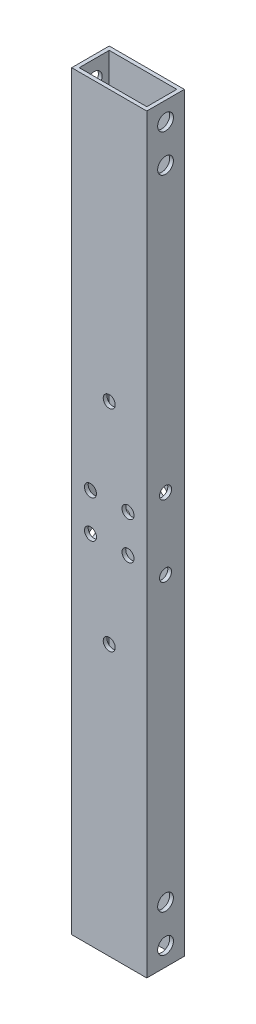
ISO-10303-21;
HEADER;
FILE_DESCRIPTION(('STEP AP214'),'2;1');
FILE_NAME('part.step','',(''),(''),'','','');
FILE_SCHEMA(('AUTOMOTIVE_DESIGN { 1 0 10303 214 1 1 1 1 }'));
ENDSEC;
DATA;
#1=APPLICATION_CONTEXT('core data for automotive mechanical design processes');
#2=APPLICATION_PROTOCOL_DEFINITION('international standard','automotive_design',2000,#1);
#3=PRODUCT_CONTEXT('',#1,'mechanical');
#4=PRODUCT('Part','Part','',(#3));
#5=PRODUCT_RELATED_PRODUCT_CATEGORY('part','',(#4));
#6=PRODUCT_DEFINITION_FORMATION('','',#4);
#7=PRODUCT_DEFINITION_CONTEXT('part definition',#1,'design');
#8=PRODUCT_DEFINITION('design','',#6,#7);
#9=PRODUCT_DEFINITION_SHAPE('','',#8);
#10=(LENGTH_UNIT() NAMED_UNIT(*) SI_UNIT(.MILLI.,.METRE.));
#11=(NAMED_UNIT(*) PLANE_ANGLE_UNIT() SI_UNIT($,.RADIAN.));
#12=(NAMED_UNIT(*) SI_UNIT($,.STERADIAN.) SOLID_ANGLE_UNIT());
#13=UNCERTAINTY_MEASURE_WITH_UNIT(LENGTH_MEASURE(1.E-05),#10,'distance_accuracy_value','');
#14=(GEOMETRIC_REPRESENTATION_CONTEXT(3) GLOBAL_UNCERTAINTY_ASSIGNED_CONTEXT((#13)) GLOBAL_UNIT_ASSIGNED_CONTEXT((#10,
#11,#12)) REPRESENTATION_CONTEXT('',''));
#15=CARTESIAN_POINT('',(0.,0.,0.));
#16=DIRECTION('',(0.,0.,1.));
#17=DIRECTION('',(1.,0.,0.));
#18=AXIS2_PLACEMENT_3D('',#15,#16,#17);
#19=CARTESIAN_POINT('',(0.,200.,0.));
#20=DIRECTION('',(0.,1.,0.));
#21=DIRECTION('',(0.,0.,1.));
#22=AXIS2_PLACEMENT_3D('',#19,#20,#21);
#23=PLANE('',#22);
#24=DIRECTION('',(0.,0.,-1.));
#25=VECTOR('',#24,1.);
#26=CARTESIAN_POINT('',(10.,200.,5.));
#27=LINE('',#26,#25);
#28=CARTESIAN_POINT('',(10.,200.,5.));
#29=VERTEX_POINT('',#28);
#30=CARTESIAN_POINT('',(10.,200.,-5.));
#31=VERTEX_POINT('',#30);
#32=EDGE_CURVE('E185',#29,#31,#27,.T.);
#33=ORIENTED_EDGE('',*,*,#32,.T.);
#34=DIRECTION('',(-1.,0.,0.));
#35=VECTOR('',#34,1.);
#36=CARTESIAN_POINT('',(-10.,200.,-5.));
#37=LINE('',#36,#35);
#38=CARTESIAN_POINT('',(-10.,200.,-5.));
#39=VERTEX_POINT('',#38);
#40=EDGE_CURVE('E189',#31,#39,#37,.T.);
#41=ORIENTED_EDGE('',*,*,#40,.T.);
#42=DIRECTION('',(0.,0.,1.));
#43=VECTOR('',#42,1.);
#44=CARTESIAN_POINT('',(-10.,200.,5.));
#45=LINE('',#44,#43);
#46=CARTESIAN_POINT('',(-10.,200.,5.));
#47=VERTEX_POINT('',#46);
#48=EDGE_CURVE('E193',#39,#47,#45,.T.);
#49=ORIENTED_EDGE('',*,*,#48,.T.);
#50=DIRECTION('',(1.,0.,0.));
#51=VECTOR('',#50,1.);
#52=CARTESIAN_POINT('',(-10.,200.,5.));
#53=LINE('',#52,#51);
#54=EDGE_CURVE('E196',#47,#29,#53,.T.);
#55=ORIENTED_EDGE('',*,*,#54,.T.);
#56=EDGE_LOOP('',(#33,#41,#49,#55));
#57=FACE_BOUND('',#56,.T.);
#58=DIRECTION('',(-1.,0.,0.));
#59=VECTOR('',#58,1.);
#60=CARTESIAN_POINT('',(0.,200.,-4.));
#61=LINE('',#60,#59);
#62=CARTESIAN_POINT('',(9.00000000000001,200.,-4.));
#63=VERTEX_POINT('',#62);
#64=CARTESIAN_POINT('',(-9.,200.,-4.));
#65=VERTEX_POINT('',#64);
#66=EDGE_CURVE('E144',#63,#65,#61,.T.);
#67=ORIENTED_EDGE('',*,*,#66,.F.);
#68=DIRECTION('',(0.,0.,-1.));
#69=VECTOR('',#68,1.);
#70=CARTESIAN_POINT('',(9.00000000000001,200.,0.));
#71=LINE('',#70,#69);
#72=CARTESIAN_POINT('',(9.00000000000001,200.,4.));
#73=VERTEX_POINT('',#72);
#74=EDGE_CURVE('E135',#73,#63,#71,.T.);
#75=ORIENTED_EDGE('',*,*,#74,.F.);
#76=DIRECTION('',(1.,0.,0.));
#77=VECTOR('',#76,1.);
#78=CARTESIAN_POINT('',(0.,200.,4.));
#79=LINE('',#78,#77);
#80=CARTESIAN_POINT('',(-9.,200.,4.));
#81=VERTEX_POINT('',#80);
#82=EDGE_CURVE('E161',#81,#73,#79,.T.);
#83=ORIENTED_EDGE('',*,*,#82,.F.);
#84=DIRECTION('',(0.,0.,1.));
#85=VECTOR('',#84,1.);
#86=CARTESIAN_POINT('',(-9.,200.,0.));
#87=LINE('',#86,#85);
#88=EDGE_CURVE('E157',#65,#81,#87,.T.);
#89=ORIENTED_EDGE('',*,*,#88,.F.);
#90=EDGE_LOOP('',(#67,#75,#83,#89));
#91=FACE_BOUND('',#90,.T.);
#92=ADVANCED_FACE('F67',(#57,#91),#23,.T.);
#93=CARTESIAN_POINT('',(0.,0.,0.));
#94=DIRECTION('',(0.,1.,0.));
#95=DIRECTION('',(0.,0.,1.));
#96=AXIS2_PLACEMENT_3D('',#93,#94,#95);
#97=PLANE('',#96);
#98=DIRECTION('',(0.,0.,-1.));
#99=VECTOR('',#98,1.);
#100=CARTESIAN_POINT('',(10.,0.,5.));
#101=LINE('',#100,#99);
#102=CARTESIAN_POINT('',(10.,0.,5.));
#103=VERTEX_POINT('',#102);
#104=CARTESIAN_POINT('',(10.,0.,-5.));
#105=VERTEX_POINT('',#104);
#106=EDGE_CURVE('E153',#103,#105,#101,.T.);
#107=ORIENTED_EDGE('',*,*,#106,.F.);
#108=DIRECTION('',(1.,0.,0.));
#109=VECTOR('',#108,1.);
#110=CARTESIAN_POINT('',(-10.,0.,5.));
#111=LINE('',#110,#109);
#112=CARTESIAN_POINT('',(-10.,0.,5.));
#113=VERTEX_POINT('',#112);
#114=EDGE_CURVE('E190',#113,#103,#111,.T.);
#115=ORIENTED_EDGE('',*,*,#114,.F.);
#116=DIRECTION('',(0.,0.,1.));
#117=VECTOR('',#116,1.);
#118=CARTESIAN_POINT('',(-10.,0.,5.));
#119=LINE('',#118,#117);
#120=CARTESIAN_POINT('',(-10.,0.,-5.));
#121=VERTEX_POINT('',#120);
#122=EDGE_CURVE('E206',#121,#113,#119,.T.);
#123=ORIENTED_EDGE('',*,*,#122,.F.);
#124=DIRECTION('',(-1.,0.,0.));
#125=VECTOR('',#124,1.);
#126=CARTESIAN_POINT('',(-10.,0.,-5.));
#127=LINE('',#126,#125);
#128=EDGE_CURVE('E203',#105,#121,#127,.T.);
#129=ORIENTED_EDGE('',*,*,#128,.F.);
#130=EDGE_LOOP('',(#107,#115,#123,#129));
#131=FACE_BOUND('',#130,.T.);
#132=DIRECTION('',(0.,0.,-1.));
#133=VECTOR('',#132,1.);
#134=CARTESIAN_POINT('',(9.00000000000001,0.,0.));
#135=LINE('',#134,#133);
#136=CARTESIAN_POINT('',(9.00000000000001,0.,4.));
#137=VERTEX_POINT('',#136);
#138=CARTESIAN_POINT('',(9.00000000000001,0.,-4.));
#139=VERTEX_POINT('',#138);
#140=EDGE_CURVE('E93',#137,#139,#135,.T.);
#141=ORIENTED_EDGE('',*,*,#140,.T.);
#142=DIRECTION('',(-1.,0.,0.));
#143=VECTOR('',#142,1.);
#144=CARTESIAN_POINT('',(0.,0.,-4.));
#145=LINE('',#144,#143);
#146=CARTESIAN_POINT('',(-9.,0.,-4.));
#147=VERTEX_POINT('',#146);
#148=EDGE_CURVE('E151',#139,#147,#145,.T.);
#149=ORIENTED_EDGE('',*,*,#148,.T.);
#150=DIRECTION('',(0.,0.,1.));
#151=VECTOR('',#150,1.);
#152=CARTESIAN_POINT('',(-9.,0.,0.));
#153=LINE('',#152,#151);
#154=CARTESIAN_POINT('',(-9.,0.,4.));
#155=VERTEX_POINT('',#154);
#156=EDGE_CURVE('E172',#147,#155,#153,.T.);
#157=ORIENTED_EDGE('',*,*,#156,.T.);
#158=DIRECTION('',(1.,0.,0.));
#159=VECTOR('',#158,1.);
#160=CARTESIAN_POINT('',(0.,0.,4.));
#161=LINE('',#160,#159);
#162=EDGE_CURVE('E145',#155,#137,#161,.T.);
#163=ORIENTED_EDGE('',*,*,#162,.T.);
#164=EDGE_LOOP('',(#141,#149,#157,#163));
#165=FACE_BOUND('',#164,.T.);
#166=ADVANCED_FACE('F411',(#131,#165),#97,.F.);
#167=CARTESIAN_POINT('',(10.,200.,5.));
#168=DIRECTION('',(-1.,0.,0.));
#169=DIRECTION('',(0.,0.,1.));
#170=AXIS2_PLACEMENT_3D('',#167,#168,#169);
#171=PLANE('',#170);
#172=CARTESIAN_POINT('',(10.,5.,0.));
#173=DIRECTION('',(1.,0.,0.));
#174=DIRECTION('',(0.,0.,-1.));
#175=AXIS2_PLACEMENT_3D('',#172,#173,#174);
#176=CIRCLE('',#175,2.1);
#177=CARTESIAN_POINT('',(10.,5.,-2.1));
#178=VERTEX_POINT('',#177);
#179=EDGE_CURVE('E486',#178,#178,#176,.T.);
#180=ORIENTED_EDGE('',*,*,#179,.F.);
#181=EDGE_LOOP('',(#180));
#182=FACE_BOUND('',#181,.T.);
#183=CARTESIAN_POINT('',(10.,15.,0.));
#184=DIRECTION('',(1.,0.,0.));
#185=DIRECTION('',(0.,0.,1.));
#186=AXIS2_PLACEMENT_3D('',#183,#184,#185);
#187=CIRCLE('',#186,2.1);
#188=CARTESIAN_POINT('',(10.,15.,2.1));
#189=VERTEX_POINT('',#188);
#190=EDGE_CURVE('E490',#189,#189,#187,.T.);
#191=ORIENTED_EDGE('',*,*,#190,.F.);
#192=EDGE_LOOP('',(#191));
#193=FACE_BOUND('',#192,.T.);
#194=CARTESIAN_POINT('',(10.,185.,0.));
#195=DIRECTION('',(1.,0.,0.));
#196=DIRECTION('',(0.,0.,-1.));
#197=AXIS2_PLACEMENT_3D('',#194,#195,#196);
#198=CIRCLE('',#197,2.1);
#199=CARTESIAN_POINT('',(10.,185.,-2.09999999999998));
#200=VERTEX_POINT('',#199);
#201=EDGE_CURVE('E494',#200,#200,#198,.T.);
#202=ORIENTED_EDGE('',*,*,#201,.F.);
#203=EDGE_LOOP('',(#202));
#204=FACE_BOUND('',#203,.T.);
#205=CARTESIAN_POINT('',(10.,195.,0.));
#206=DIRECTION('',(1.,0.,0.));
#207=DIRECTION('',(0.,0.,1.));
#208=AXIS2_PLACEMENT_3D('',#205,#206,#207);
#209=CIRCLE('',#208,2.1);
#210=CARTESIAN_POINT('',(10.,195.,2.10000000000002));
#211=VERTEX_POINT('',#210);
#212=EDGE_CURVE('E498',#211,#211,#209,.T.);
#213=ORIENTED_EDGE('',*,*,#212,.F.);
#214=EDGE_LOOP('',(#213));
#215=FACE_BOUND('',#214,.T.);
#216=CARTESIAN_POINT('',(10.,109.5,0.));
#217=DIRECTION('',(1.,0.,0.));
#218=DIRECTION('',(0.,0.,-1.));
#219=AXIS2_PLACEMENT_3D('',#216,#217,#218);
#220=CIRCLE('',#219,1.59999999999999);
#221=CARTESIAN_POINT('',(10.,109.5,-1.59999999999998));
#222=VERTEX_POINT('',#221);
#223=EDGE_CURVE('E341',#222,#222,#220,.T.);
#224=ORIENTED_EDGE('',*,*,#223,.F.);
#225=EDGE_LOOP('',(#224));
#226=FACE_BOUND('',#225,.T.);
#227=CARTESIAN_POINT('',(10.,90.5,0.));
#228=DIRECTION('',(1.,0.,0.));
#229=DIRECTION('',(0.,0.,1.));
#230=AXIS2_PLACEMENT_3D('',#227,#228,#229);
#231=CIRCLE('',#230,1.59999999999999);
#232=CARTESIAN_POINT('',(10.,90.5,1.59999999999999));
#233=VERTEX_POINT('',#232);
#234=EDGE_CURVE('E345',#233,#233,#231,.T.);
#235=ORIENTED_EDGE('',*,*,#234,.F.);
#236=EDGE_LOOP('',(#235));
#237=FACE_BOUND('',#236,.T.);
#238=ORIENTED_EDGE('',*,*,#106,.T.);
#239=DIRECTION('',(0.,-1.,0.));
#240=VECTOR('',#239,1.);
#241=CARTESIAN_POINT('',(10.,200.,-5.));
#242=LINE('',#241,#240);
#243=EDGE_CURVE('E12',#31,#105,#242,.T.);
#244=ORIENTED_EDGE('',*,*,#243,.F.);
#245=ORIENTED_EDGE('',*,*,#32,.F.);
#246=DIRECTION('',(0.,-1.,0.));
#247=VECTOR('',#246,1.);
#248=CARTESIAN_POINT('',(10.,200.,5.));
#249=LINE('',#248,#247);
#250=EDGE_CURVE('E199',#29,#103,#249,.T.);
#251=ORIENTED_EDGE('',*,*,#250,.T.);
#252=EDGE_LOOP('',(#238,#244,#245,#251));
#253=FACE_BOUND('',#252,.T.);
#254=ADVANCED_FACE('F69',(#182,#193,#204,#215,#226,#237,#253),#171,.F.);
#255=CARTESIAN_POINT('',(-10.,200.,-5.));
#256=DIRECTION('',(0.,0.,1.));
#257=DIRECTION('',(1.,0.,0.));
#258=AXIS2_PLACEMENT_3D('',#255,#256,#257);
#259=PLANE('',#258);
#260=CARTESIAN_POINT('',(-5.,105.,-5.));
#261=DIRECTION('',(0.,0.,-1.));
#262=DIRECTION('',(1.,0.,0.));
#263=AXIS2_PLACEMENT_3D('',#260,#261,#262);
#264=CIRCLE('',#263,1.59999999999999);
#265=CARTESIAN_POINT('',(-3.40000000000001,105.,-5.));
#266=VERTEX_POINT('',#265);
#267=EDGE_CURVE('E312',#266,#266,#264,.T.);
#268=ORIENTED_EDGE('',*,*,#267,.F.);
#269=EDGE_LOOP('',(#268));
#270=FACE_BOUND('',#269,.T.);
#271=CARTESIAN_POINT('',(-5.,95.,-5.));
#272=DIRECTION('',(0.,0.,-1.));
#273=DIRECTION('',(-1.,0.,0.));
#274=AXIS2_PLACEMENT_3D('',#271,#272,#273);
#275=CIRCLE('',#274,1.59999999999999);
#276=CARTESIAN_POINT('',(-6.59999999999999,95.,-5.));
#277=VERTEX_POINT('',#276);
#278=EDGE_CURVE('E304',#277,#277,#275,.T.);
#279=ORIENTED_EDGE('',*,*,#278,.F.);
#280=EDGE_LOOP('',(#279));
#281=FACE_BOUND('',#280,.T.);
#282=CARTESIAN_POINT('',(5.,95.,-5.));
#283=DIRECTION('',(0.,0.,-1.));
#284=DIRECTION('',(1.,0.,0.));
#285=AXIS2_PLACEMENT_3D('',#282,#283,#284);
#286=CIRCLE('',#285,1.59999999999999);
#287=CARTESIAN_POINT('',(6.59999999999999,95.,-5.));
#288=VERTEX_POINT('',#287);
#289=EDGE_CURVE('E295',#288,#288,#286,.T.);
#290=ORIENTED_EDGE('',*,*,#289,.F.);
#291=EDGE_LOOP('',(#290));
#292=FACE_BOUND('',#291,.T.);
#293=CARTESIAN_POINT('',(5.,105.,-5.));
#294=DIRECTION('',(0.,0.,-1.));
#295=DIRECTION('',(-1.,0.,0.));
#296=AXIS2_PLACEMENT_3D('',#293,#294,#295);
#297=CIRCLE('',#296,1.59999999999999);
#298=CARTESIAN_POINT('',(3.40000000000001,105.,-5.));
#299=VERTEX_POINT('',#298);
#300=EDGE_CURVE('E299',#299,#299,#297,.T.);
#301=ORIENTED_EDGE('',*,*,#300,.F.);
#302=EDGE_LOOP('',(#301));
#303=FACE_BOUND('',#302,.T.);
#304=CARTESIAN_POINT('',(0.,128.,-5.));
#305=DIRECTION('',(0.,0.,1.));
#306=DIRECTION('',(1.,0.,0.));
#307=AXIS2_PLACEMENT_3D('',#304,#305,#306);
#308=CIRCLE('',#307,1.59999999999999);
#309=CARTESIAN_POINT('',(1.59999999999999,128.,-5.));
#310=VERTEX_POINT('',#309);
#311=EDGE_CURVE('E226',#310,#310,#308,.T.);
#312=ORIENTED_EDGE('',*,*,#311,.T.);
#313=EDGE_LOOP('',(#312));
#314=FACE_BOUND('',#313,.T.);
#315=CARTESIAN_POINT('',(0.,72.,-5.));
#316=DIRECTION('',(0.,0.,1.));
#317=DIRECTION('',(-1.,0.,0.));
#318=AXIS2_PLACEMENT_3D('',#315,#316,#317);
#319=CIRCLE('',#318,1.6);
#320=CARTESIAN_POINT('',(-1.6,72.,-5.));
#321=VERTEX_POINT('',#320);
#322=EDGE_CURVE('E358',#321,#321,#319,.T.);
#323=ORIENTED_EDGE('',*,*,#322,.T.);
#324=EDGE_LOOP('',(#323));
#325=FACE_BOUND('',#324,.T.);
#326=ORIENTED_EDGE('',*,*,#128,.T.);
#327=DIRECTION('',(0.,-1.,0.));
#328=VECTOR('',#327,1.);
#329=CARTESIAN_POINT('',(-10.,200.,-5.));
#330=LINE('',#329,#328);
#331=EDGE_CURVE('E77',#39,#121,#330,.T.);
#332=ORIENTED_EDGE('',*,*,#331,.F.);
#333=ORIENTED_EDGE('',*,*,#40,.F.);
#334=ORIENTED_EDGE('',*,*,#243,.T.);
#335=EDGE_LOOP('',(#326,#332,#333,#334));
#336=FACE_BOUND('',#335,.T.);
#337=ADVANCED_FACE('F397',(#270,#281,#292,#303,#314,#325,#336),#259,.F.);
#338=CARTESIAN_POINT('',(-10.,200.,5.));
#339=DIRECTION('',(1.,0.,0.));
#340=DIRECTION('',(0.,0.,-1.));
#341=AXIS2_PLACEMENT_3D('',#338,#339,#340);
#342=PLANE('',#341);
#343=CARTESIAN_POINT('',(-10.,5.,0.));
#344=DIRECTION('',(1.,0.,0.));
#345=DIRECTION('',(0.,0.,-1.));
#346=AXIS2_PLACEMENT_3D('',#343,#344,#345);
#347=CIRCLE('',#346,2.1);
#348=CARTESIAN_POINT('',(-10.,5.,-2.1));
#349=VERTEX_POINT('',#348);
#350=EDGE_CURVE('E268',#349,#349,#347,.T.);
#351=ORIENTED_EDGE('',*,*,#350,.T.);
#352=EDGE_LOOP('',(#351));
#353=FACE_BOUND('',#352,.T.);
#354=CARTESIAN_POINT('',(-10.,15.,0.));
#355=DIRECTION('',(1.,0.,0.));
#356=DIRECTION('',(0.,0.,1.));
#357=AXIS2_PLACEMENT_3D('',#354,#355,#356);
#358=CIRCLE('',#357,2.1);
#359=CARTESIAN_POINT('',(-10.,15.,2.1));
#360=VERTEX_POINT('',#359);
#361=EDGE_CURVE('E441',#360,#360,#358,.T.);
#362=ORIENTED_EDGE('',*,*,#361,.T.);
#363=EDGE_LOOP('',(#362));
#364=FACE_BOUND('',#363,.T.);
#365=CARTESIAN_POINT('',(-10.,185.,0.));
#366=DIRECTION('',(1.,0.,0.));
#367=DIRECTION('',(0.,0.,-1.));
#368=AXIS2_PLACEMENT_3D('',#365,#366,#367);
#369=CIRCLE('',#368,2.1);
#370=CARTESIAN_POINT('',(-10.,185.,-2.09999999999998));
#371=VERTEX_POINT('',#370);
#372=EDGE_CURVE('E445',#371,#371,#369,.T.);
#373=ORIENTED_EDGE('',*,*,#372,.T.);
#374=EDGE_LOOP('',(#373));
#375=FACE_BOUND('',#374,.T.);
#376=CARTESIAN_POINT('',(-10.,195.,0.));
#377=DIRECTION('',(1.,0.,0.));
#378=DIRECTION('',(0.,0.,1.));
#379=AXIS2_PLACEMENT_3D('',#376,#377,#378);
#380=CIRCLE('',#379,2.1);
#381=CARTESIAN_POINT('',(-10.,195.,2.10000000000002));
#382=VERTEX_POINT('',#381);
#383=EDGE_CURVE('E449',#382,#382,#380,.T.);
#384=ORIENTED_EDGE('',*,*,#383,.T.);
#385=EDGE_LOOP('',(#384));
#386=FACE_BOUND('',#385,.T.);
#387=CARTESIAN_POINT('',(-10.,109.5,0.));
#388=DIRECTION('',(1.,0.,0.));
#389=DIRECTION('',(0.,0.,-1.));
#390=AXIS2_PLACEMENT_3D('',#387,#388,#389);
#391=CIRCLE('',#390,1.59999999999999);
#392=CARTESIAN_POINT('',(-10.,109.5,-1.59999999999998));
#393=VERTEX_POINT('',#392);
#394=EDGE_CURVE('E236',#393,#393,#391,.T.);
#395=ORIENTED_EDGE('',*,*,#394,.T.);
#396=EDGE_LOOP('',(#395));
#397=FACE_BOUND('',#396,.T.);
#398=CARTESIAN_POINT('',(-10.,90.5,0.));
#399=DIRECTION('',(1.,0.,0.));
#400=DIRECTION('',(0.,0.,1.));
#401=AXIS2_PLACEMENT_3D('',#398,#399,#400);
#402=CIRCLE('',#401,1.59999999999999);
#403=CARTESIAN_POINT('',(-10.,90.5,1.59999999999999));
#404=VERTEX_POINT('',#403);
#405=EDGE_CURVE('E337',#404,#404,#402,.T.);
#406=ORIENTED_EDGE('',*,*,#405,.T.);
#407=EDGE_LOOP('',(#406));
#408=FACE_BOUND('',#407,.T.);
#409=ORIENTED_EDGE('',*,*,#122,.T.);
#410=DIRECTION('',(0.,-1.,0.));
#411=VECTOR('',#410,1.);
#412=CARTESIAN_POINT('',(-10.,200.,5.));
#413=LINE('',#412,#411);
#414=EDGE_CURVE('E214',#47,#113,#413,.T.);
#415=ORIENTED_EDGE('',*,*,#414,.F.);
#416=ORIENTED_EDGE('',*,*,#48,.F.);
#417=ORIENTED_EDGE('',*,*,#331,.T.);
#418=EDGE_LOOP('',(#409,#415,#416,#417));
#419=FACE_BOUND('',#418,.T.);
#420=ADVANCED_FACE('F400',(#353,#364,#375,#386,#397,#408,#419),#342,.F.);
#421=CARTESIAN_POINT('',(-10.,200.,5.));
#422=DIRECTION('',(0.,0.,-1.));
#423=DIRECTION('',(-1.,0.,0.));
#424=AXIS2_PLACEMENT_3D('',#421,#422,#423);
#425=PLANE('',#424);
#426=CARTESIAN_POINT('',(-5.,105.,5.));
#427=DIRECTION('',(0.,0.,-1.));
#428=DIRECTION('',(1.,0.,0.));
#429=AXIS2_PLACEMENT_3D('',#426,#427,#428);
#430=CIRCLE('',#429,1.59999999999999);
#431=CARTESIAN_POINT('',(-3.40000000000001,105.,5.));
#432=VERTEX_POINT('',#431);
#433=EDGE_CURVE('E294',#432,#432,#430,.T.);
#434=ORIENTED_EDGE('',*,*,#433,.T.);
#435=EDGE_LOOP('',(#434));
#436=FACE_BOUND('',#435,.T.);
#437=CARTESIAN_POINT('',(-5.,95.,5.));
#438=DIRECTION('',(0.,0.,-1.));
#439=DIRECTION('',(-1.,0.,0.));
#440=AXIS2_PLACEMENT_3D('',#437,#438,#439);
#441=CIRCLE('',#440,1.59999999999999);
#442=CARTESIAN_POINT('',(-6.59999999999999,95.,5.));
#443=VERTEX_POINT('',#442);
#444=EDGE_CURVE('E308',#443,#443,#441,.T.);
#445=ORIENTED_EDGE('',*,*,#444,.T.);
#446=EDGE_LOOP('',(#445));
#447=FACE_BOUND('',#446,.T.);
#448=CARTESIAN_POINT('',(5.,95.,5.));
#449=DIRECTION('',(0.,0.,-1.));
#450=DIRECTION('',(1.,0.,0.));
#451=AXIS2_PLACEMENT_3D('',#448,#449,#450);
#452=CIRCLE('',#451,1.59999999999999);
#453=CARTESIAN_POINT('',(6.59999999999999,95.,5.));
#454=VERTEX_POINT('',#453);
#455=EDGE_CURVE('E300',#454,#454,#452,.T.);
#456=ORIENTED_EDGE('',*,*,#455,.T.);
#457=EDGE_LOOP('',(#456));
#458=FACE_BOUND('',#457,.T.);
#459=CARTESIAN_POINT('',(5.,105.,5.));
#460=DIRECTION('',(0.,0.,-1.));
#461=DIRECTION('',(-1.,0.,0.));
#462=AXIS2_PLACEMENT_3D('',#459,#460,#461);
#463=CIRCLE('',#462,1.59999999999999);
#464=CARTESIAN_POINT('',(3.40000000000001,105.,5.));
#465=VERTEX_POINT('',#464);
#466=EDGE_CURVE('E247',#465,#465,#463,.T.);
#467=ORIENTED_EDGE('',*,*,#466,.T.);
#468=EDGE_LOOP('',(#467));
#469=FACE_BOUND('',#468,.T.);
#470=CARTESIAN_POINT('',(0.,128.,5.));
#471=DIRECTION('',(0.,0.,1.));
#472=DIRECTION('',(1.,0.,0.));
#473=AXIS2_PLACEMENT_3D('',#470,#471,#472);
#474=CIRCLE('',#473,1.59999999999999);
#475=CARTESIAN_POINT('',(1.59999999999999,128.,5.));
#476=VERTEX_POINT('',#475);
#477=EDGE_CURVE('E362',#476,#476,#474,.T.);
#478=ORIENTED_EDGE('',*,*,#477,.F.);
#479=EDGE_LOOP('',(#478));
#480=FACE_BOUND('',#479,.T.);
#481=CARTESIAN_POINT('',(0.,72.,5.));
#482=DIRECTION('',(0.,0.,1.));
#483=DIRECTION('',(-1.,0.,0.));
#484=AXIS2_PLACEMENT_3D('',#481,#482,#483);
#485=CIRCLE('',#484,1.6);
#486=CARTESIAN_POINT('',(-1.6,72.,5.));
#487=VERTEX_POINT('',#486);
#488=EDGE_CURVE('E366',#487,#487,#485,.T.);
#489=ORIENTED_EDGE('',*,*,#488,.F.);
#490=EDGE_LOOP('',(#489));
#491=FACE_BOUND('',#490,.T.);
#492=ORIENTED_EDGE('',*,*,#114,.T.);
#493=ORIENTED_EDGE('',*,*,#250,.F.);
#494=ORIENTED_EDGE('',*,*,#54,.F.);
#495=ORIENTED_EDGE('',*,*,#414,.T.);
#496=EDGE_LOOP('',(#492,#493,#494,#495));
#497=FACE_BOUND('',#496,.T.);
#498=ADVANCED_FACE('F415',(#436,#447,#458,#469,#480,#491,#497),#425,.F.);
#499=CARTESIAN_POINT('',(9.00000000000001,200.,0.));
#500=DIRECTION('',(-1.,0.,0.));
#501=DIRECTION('',(0.,0.,1.));
#502=AXIS2_PLACEMENT_3D('',#499,#500,#501);
#503=PLANE('',#502);
#504=CARTESIAN_POINT('',(9.00000000000001,5.,0.));
#505=DIRECTION('',(-1.,0.,0.));
#506=DIRECTION('',(0.,0.,1.));
#507=AXIS2_PLACEMENT_3D('',#504,#505,#506);
#508=CIRCLE('',#507,2.1);
#509=CARTESIAN_POINT('',(9.00000000000001,5.,2.1));
#510=VERTEX_POINT('',#509);
#511=EDGE_CURVE('E290',#510,#510,#508,.T.);
#512=ORIENTED_EDGE('',*,*,#511,.F.);
#513=EDGE_LOOP('',(#512));
#514=FACE_BOUND('',#513,.T.);
#515=CARTESIAN_POINT('',(9.00000000000001,15.,0.));
#516=DIRECTION('',(-1.,0.,0.));
#517=DIRECTION('',(0.,0.,1.));
#518=AXIS2_PLACEMENT_3D('',#515,#516,#517);
#519=CIRCLE('',#518,2.1);
#520=CARTESIAN_POINT('',(9.00000000000001,15.,2.1));
#521=VERTEX_POINT('',#520);
#522=EDGE_CURVE('E276',#521,#521,#519,.T.);
#523=ORIENTED_EDGE('',*,*,#522,.F.);
#524=EDGE_LOOP('',(#523));
#525=FACE_BOUND('',#524,.T.);
#526=CARTESIAN_POINT('',(9.00000000000001,185.,0.));
#527=DIRECTION('',(-1.,0.,0.));
#528=DIRECTION('',(0.,0.,1.));
#529=AXIS2_PLACEMENT_3D('',#526,#527,#528);
#530=CIRCLE('',#529,2.1);
#531=CARTESIAN_POINT('',(9.00000000000001,185.,2.10000000000001));
#532=VERTEX_POINT('',#531);
#533=EDGE_CURVE('E272',#532,#532,#530,.T.);
#534=ORIENTED_EDGE('',*,*,#533,.F.);
#535=EDGE_LOOP('',(#534));
#536=FACE_BOUND('',#535,.T.);
#537=CARTESIAN_POINT('',(9.00000000000001,195.,0.));
#538=DIRECTION('',(-1.,0.,0.));
#539=DIRECTION('',(0.,0.,1.));
#540=AXIS2_PLACEMENT_3D('',#537,#538,#539);
#541=CIRCLE('',#540,2.1);
#542=CARTESIAN_POINT('',(9.00000000000001,195.,2.10000000000002));
#543=VERTEX_POINT('',#542);
#544=EDGE_CURVE('E267',#543,#543,#541,.T.);
#545=ORIENTED_EDGE('',*,*,#544,.F.);
#546=EDGE_LOOP('',(#545));
#547=FACE_BOUND('',#546,.T.);
#548=CARTESIAN_POINT('',(9.00000000000001,109.5,0.));
#549=DIRECTION('',(-1.,0.,0.));
#550=DIRECTION('',(0.,0.,1.));
#551=AXIS2_PLACEMENT_3D('',#548,#549,#550);
#552=CIRCLE('',#551,1.59999999999999);
#553=CARTESIAN_POINT('',(9.00000000000001,109.5,1.59999999999999));
#554=VERTEX_POINT('',#553);
#555=EDGE_CURVE('E241',#554,#554,#552,.T.);
#556=ORIENTED_EDGE('',*,*,#555,.F.);
#557=EDGE_LOOP('',(#556));
#558=FACE_BOUND('',#557,.T.);
#559=CARTESIAN_POINT('',(9.00000000000001,90.5,0.));
#560=DIRECTION('',(-1.,0.,0.));
#561=DIRECTION('',(0.,0.,1.));
#562=AXIS2_PLACEMENT_3D('',#559,#560,#561);
#563=CIRCLE('',#562,1.59999999999999);
#564=CARTESIAN_POINT('',(9.00000000000001,90.5,1.59999999999999));
#565=VERTEX_POINT('',#564);
#566=EDGE_CURVE('E235',#565,#565,#563,.T.);
#567=ORIENTED_EDGE('',*,*,#566,.F.);
#568=EDGE_LOOP('',(#567));
#569=FACE_BOUND('',#568,.T.);
#570=ORIENTED_EDGE('',*,*,#140,.F.);
#571=DIRECTION('',(0.,-1.,0.));
#572=VECTOR('',#571,1.);
#573=CARTESIAN_POINT('',(9.00000000000001,200.,4.));
#574=LINE('',#573,#572);
#575=EDGE_CURVE('E139',#73,#137,#574,.T.);
#576=ORIENTED_EDGE('',*,*,#575,.F.);
#577=ORIENTED_EDGE('',*,*,#74,.T.);
#578=DIRECTION('',(0.,-1.,0.));
#579=VECTOR('',#578,1.);
#580=CARTESIAN_POINT('',(9.00000000000001,200.,-4.));
#581=LINE('',#580,#579);
#582=EDGE_CURVE('E138',#63,#139,#581,.T.);
#583=ORIENTED_EDGE('',*,*,#582,.T.);
#584=EDGE_LOOP('',(#570,#576,#577,#583));
#585=FACE_BOUND('',#584,.T.);
#586=ADVANCED_FACE('F137',(#514,#525,#536,#547,#558,#569,#585),#503,.T.);
#587=CARTESIAN_POINT('',(0.,200.,-4.));
#588=DIRECTION('',(0.,0.,1.));
#589=DIRECTION('',(1.,0.,0.));
#590=AXIS2_PLACEMENT_3D('',#587,#588,#589);
#591=PLANE('',#590);
#592=CARTESIAN_POINT('',(-5.,105.,-4.));
#593=DIRECTION('',(0.,0.,1.));
#594=DIRECTION('',(1.,0.,0.));
#595=AXIS2_PLACEMENT_3D('',#592,#593,#594);
#596=CIRCLE('',#595,1.59999999999999);
#597=CARTESIAN_POINT('',(-3.40000000000001,105.,-4.));
#598=VERTEX_POINT('',#597);
#599=EDGE_CURVE('E262',#598,#598,#596,.T.);
#600=ORIENTED_EDGE('',*,*,#599,.F.);
#601=EDGE_LOOP('',(#600));
#602=FACE_BOUND('',#601,.T.);
#603=CARTESIAN_POINT('',(-5.,95.,-4.));
#604=DIRECTION('',(0.,0.,1.));
#605=DIRECTION('',(1.,0.,0.));
#606=AXIS2_PLACEMENT_3D('',#603,#604,#605);
#607=CIRCLE('',#606,1.59999999999999);
#608=CARTESIAN_POINT('',(-3.40000000000001,95.,-4.));
#609=VERTEX_POINT('',#608);
#610=EDGE_CURVE('E257',#609,#609,#607,.T.);
#611=ORIENTED_EDGE('',*,*,#610,.F.);
#612=EDGE_LOOP('',(#611));
#613=FACE_BOUND('',#612,.T.);
#614=CARTESIAN_POINT('',(5.,95.,-4.));
#615=DIRECTION('',(0.,0.,1.));
#616=DIRECTION('',(1.,0.,0.));
#617=AXIS2_PLACEMENT_3D('',#614,#615,#616);
#618=CIRCLE('',#617,1.59999999999999);
#619=CARTESIAN_POINT('',(6.59999999999999,95.,-4.));
#620=VERTEX_POINT('',#619);
#621=EDGE_CURVE('E252',#620,#620,#618,.T.);
#622=ORIENTED_EDGE('',*,*,#621,.F.);
#623=EDGE_LOOP('',(#622));
#624=FACE_BOUND('',#623,.T.);
#625=CARTESIAN_POINT('',(5.,105.,-4.));
#626=DIRECTION('',(0.,0.,1.));
#627=DIRECTION('',(1.,0.,0.));
#628=AXIS2_PLACEMENT_3D('',#625,#626,#627);
#629=CIRCLE('',#628,1.59999999999999);
#630=CARTESIAN_POINT('',(6.59999999999999,105.,-4.));
#631=VERTEX_POINT('',#630);
#632=EDGE_CURVE('E246',#631,#631,#629,.T.);
#633=ORIENTED_EDGE('',*,*,#632,.F.);
#634=EDGE_LOOP('',(#633));
#635=FACE_BOUND('',#634,.T.);
#636=CARTESIAN_POINT('',(0.,128.,-4.));
#637=DIRECTION('',(0.,0.,1.));
#638=DIRECTION('',(1.,0.,0.));
#639=AXIS2_PLACEMENT_3D('',#636,#637,#638);
#640=CIRCLE('',#639,1.59999999999999);
#641=CARTESIAN_POINT('',(1.59999999999999,128.,-4.));
#642=VERTEX_POINT('',#641);
#643=EDGE_CURVE('E169',#642,#642,#640,.T.);
#644=ORIENTED_EDGE('',*,*,#643,.F.);
#645=EDGE_LOOP('',(#644));
#646=FACE_BOUND('',#645,.T.);
#647=CARTESIAN_POINT('',(0.,72.,-4.));
#648=DIRECTION('',(0.,0.,1.));
#649=DIRECTION('',(1.,0.,0.));
#650=AXIS2_PLACEMENT_3D('',#647,#648,#649);
#651=CIRCLE('',#650,1.6);
#652=CARTESIAN_POINT('',(1.6,72.,-4.));
#653=VERTEX_POINT('',#652);
#654=EDGE_CURVE('E225',#653,#653,#651,.T.);
#655=ORIENTED_EDGE('',*,*,#654,.F.);
#656=EDGE_LOOP('',(#655));
#657=FACE_BOUND('',#656,.T.);
#658=ORIENTED_EDGE('',*,*,#148,.F.);
#659=ORIENTED_EDGE('',*,*,#582,.F.);
#660=ORIENTED_EDGE('',*,*,#66,.T.);
#661=DIRECTION('',(0.,-1.,0.));
#662=VECTOR('',#661,1.);
#663=CARTESIAN_POINT('',(-9.,200.,-4.));
#664=LINE('',#663,#662);
#665=EDGE_CURVE('E154',#65,#147,#664,.T.);
#666=ORIENTED_EDGE('',*,*,#665,.T.);
#667=EDGE_LOOP('',(#658,#659,#660,#666));
#668=FACE_BOUND('',#667,.T.);
#669=ADVANCED_FACE('F148',(#602,#613,#624,#635,#646,#657,#668),#591,.T.);
#670=CARTESIAN_POINT('',(-9.,200.,0.));
#671=DIRECTION('',(1.,0.,0.));
#672=DIRECTION('',(0.,0.,-1.));
#673=AXIS2_PLACEMENT_3D('',#670,#671,#672);
#674=PLANE('',#673);
#675=CARTESIAN_POINT('',(-9.,5.,0.));
#676=DIRECTION('',(1.,0.,0.));
#677=DIRECTION('',(0.,0.,-1.));
#678=AXIS2_PLACEMENT_3D('',#675,#676,#677);
#679=CIRCLE('',#678,2.1);
#680=CARTESIAN_POINT('',(-9.,5.,-2.1));
#681=VERTEX_POINT('',#680);
#682=EDGE_CURVE('E71',#681,#681,#679,.T.);
#683=ORIENTED_EDGE('',*,*,#682,.F.);
#684=EDGE_LOOP('',(#683));
#685=FACE_BOUND('',#684,.T.);
#686=CARTESIAN_POINT('',(-9.,15.,0.));
#687=DIRECTION('',(1.,0.,0.));
#688=DIRECTION('',(0.,0.,-1.));
#689=AXIS2_PLACEMENT_3D('',#686,#687,#688);
#690=CIRCLE('',#689,2.1);
#691=CARTESIAN_POINT('',(-9.,15.,-2.1));
#692=VERTEX_POINT('',#691);
#693=EDGE_CURVE('E273',#692,#692,#690,.T.);
#694=ORIENTED_EDGE('',*,*,#693,.F.);
#695=EDGE_LOOP('',(#694));
#696=FACE_BOUND('',#695,.T.);
#697=CARTESIAN_POINT('',(-9.,185.,0.));
#698=DIRECTION('',(1.,0.,0.));
#699=DIRECTION('',(0.,0.,-1.));
#700=AXIS2_PLACEMENT_3D('',#697,#698,#699);
#701=CIRCLE('',#700,2.1);
#702=CARTESIAN_POINT('',(-9.,185.,-2.09999999999998));
#703=VERTEX_POINT('',#702);
#704=EDGE_CURVE('E269',#703,#703,#701,.T.);
#705=ORIENTED_EDGE('',*,*,#704,.F.);
#706=EDGE_LOOP('',(#705));
#707=FACE_BOUND('',#706,.T.);
#708=CARTESIAN_POINT('',(-9.,195.,0.));
#709=DIRECTION('',(1.,0.,0.));
#710=DIRECTION('',(0.,0.,-1.));
#711=AXIS2_PLACEMENT_3D('',#708,#709,#710);
#712=CIRCLE('',#711,2.1);
#713=CARTESIAN_POINT('',(-9.,195.,-2.09999999999997));
#714=VERTEX_POINT('',#713);
#715=EDGE_CURVE('E263',#714,#714,#712,.T.);
#716=ORIENTED_EDGE('',*,*,#715,.F.);
#717=EDGE_LOOP('',(#716));
#718=FACE_BOUND('',#717,.T.);
#719=CARTESIAN_POINT('',(-9.,109.5,0.));
#720=DIRECTION('',(1.,0.,0.));
#721=DIRECTION('',(0.,0.,-1.));
#722=AXIS2_PLACEMENT_3D('',#719,#720,#721);
#723=CIRCLE('',#722,1.59999999999999);
#724=CARTESIAN_POINT('',(-9.,109.5,-1.59999999999998));
#725=VERTEX_POINT('',#724);
#726=EDGE_CURVE('E237',#725,#725,#723,.T.);
#727=ORIENTED_EDGE('',*,*,#726,.F.);
#728=EDGE_LOOP('',(#727));
#729=FACE_BOUND('',#728,.T.);
#730=CARTESIAN_POINT('',(-9.,90.5,0.));
#731=DIRECTION('',(1.,0.,0.));
#732=DIRECTION('',(0.,0.,-1.));
#733=AXIS2_PLACEMENT_3D('',#730,#731,#732);
#734=CIRCLE('',#733,1.59999999999999);
#735=CARTESIAN_POINT('',(-9.,90.5,-1.59999999999998));
#736=VERTEX_POINT('',#735);
#737=EDGE_CURVE('E231',#736,#736,#734,.T.);
#738=ORIENTED_EDGE('',*,*,#737,.F.);
#739=EDGE_LOOP('',(#738));
#740=FACE_BOUND('',#739,.T.);
#741=ORIENTED_EDGE('',*,*,#156,.F.);
#742=ORIENTED_EDGE('',*,*,#665,.F.);
#743=ORIENTED_EDGE('',*,*,#88,.T.);
#744=DIRECTION('',(0.,-1.,0.));
#745=VECTOR('',#744,1.);
#746=CARTESIAN_POINT('',(-9.,200.,4.));
#747=LINE('',#746,#745);
#748=EDGE_CURVE('E85',#81,#155,#747,.T.);
#749=ORIENTED_EDGE('',*,*,#748,.T.);
#750=EDGE_LOOP('',(#741,#742,#743,#749));
#751=FACE_BOUND('',#750,.T.);
#752=ADVANCED_FACE('F384',(#685,#696,#707,#718,#729,#740,#751),#674,.T.);
#753=CARTESIAN_POINT('',(0.,200.,4.));
#754=DIRECTION('',(0.,0.,-1.));
#755=DIRECTION('',(-1.,0.,0.));
#756=AXIS2_PLACEMENT_3D('',#753,#754,#755);
#757=PLANE('',#756);
#758=CARTESIAN_POINT('',(-5.,105.,4.));
#759=DIRECTION('',(0.,0.,-1.));
#760=DIRECTION('',(-1.,0.,0.));
#761=AXIS2_PLACEMENT_3D('',#758,#759,#760);
#762=CIRCLE('',#761,1.59999999999999);
#763=CARTESIAN_POINT('',(-6.59999999999999,105.,4.));
#764=VERTEX_POINT('',#763);
#765=EDGE_CURVE('E258',#764,#764,#762,.T.);
#766=ORIENTED_EDGE('',*,*,#765,.F.);
#767=EDGE_LOOP('',(#766));
#768=FACE_BOUND('',#767,.T.);
#769=CARTESIAN_POINT('',(-5.,95.,4.));
#770=DIRECTION('',(0.,0.,-1.));
#771=DIRECTION('',(-1.,0.,0.));
#772=AXIS2_PLACEMENT_3D('',#769,#770,#771);
#773=CIRCLE('',#772,1.59999999999999);
#774=CARTESIAN_POINT('',(-6.59999999999999,95.,4.));
#775=VERTEX_POINT('',#774);
#776=EDGE_CURVE('E253',#775,#775,#773,.T.);
#777=ORIENTED_EDGE('',*,*,#776,.F.);
#778=EDGE_LOOP('',(#777));
#779=FACE_BOUND('',#778,.T.);
#780=CARTESIAN_POINT('',(5.,95.,4.));
#781=DIRECTION('',(0.,0.,-1.));
#782=DIRECTION('',(-1.,0.,0.));
#783=AXIS2_PLACEMENT_3D('',#780,#781,#782);
#784=CIRCLE('',#783,1.59999999999999);
#785=CARTESIAN_POINT('',(3.40000000000001,95.,4.));
#786=VERTEX_POINT('',#785);
#787=EDGE_CURVE('E248',#786,#786,#784,.T.);
#788=ORIENTED_EDGE('',*,*,#787,.F.);
#789=EDGE_LOOP('',(#788));
#790=FACE_BOUND('',#789,.T.);
#791=CARTESIAN_POINT('',(5.,105.,4.));
#792=DIRECTION('',(0.,0.,-1.));
#793=DIRECTION('',(-1.,0.,0.));
#794=AXIS2_PLACEMENT_3D('',#791,#792,#793);
#795=CIRCLE('',#794,1.59999999999999);
#796=CARTESIAN_POINT('',(3.40000000000001,105.,4.));
#797=VERTEX_POINT('',#796);
#798=EDGE_CURVE('E242',#797,#797,#795,.T.);
#799=ORIENTED_EDGE('',*,*,#798,.F.);
#800=EDGE_LOOP('',(#799));
#801=FACE_BOUND('',#800,.T.);
#802=CARTESIAN_POINT('',(0.,128.,4.));
#803=DIRECTION('',(0.,0.,-1.));
#804=DIRECTION('',(-1.,0.,0.));
#805=AXIS2_PLACEMENT_3D('',#802,#803,#804);
#806=CIRCLE('',#805,1.59999999999999);
#807=CARTESIAN_POINT('',(-1.6,128.,4.));
#808=VERTEX_POINT('',#807);
#809=EDGE_CURVE('E227',#808,#808,#806,.T.);
#810=ORIENTED_EDGE('',*,*,#809,.F.);
#811=EDGE_LOOP('',(#810));
#812=FACE_BOUND('',#811,.T.);
#813=CARTESIAN_POINT('',(0.,72.,4.));
#814=DIRECTION('',(0.,0.,-1.));
#815=DIRECTION('',(-1.,0.,0.));
#816=AXIS2_PLACEMENT_3D('',#813,#814,#815);
#817=CIRCLE('',#816,1.6);
#818=CARTESIAN_POINT('',(-1.6,72.,4.));
#819=VERTEX_POINT('',#818);
#820=EDGE_CURVE('E221',#819,#819,#817,.T.);
#821=ORIENTED_EDGE('',*,*,#820,.F.);
#822=EDGE_LOOP('',(#821));
#823=FACE_BOUND('',#822,.T.);
#824=ORIENTED_EDGE('',*,*,#162,.F.);
#825=ORIENTED_EDGE('',*,*,#748,.F.);
#826=ORIENTED_EDGE('',*,*,#82,.T.);
#827=ORIENTED_EDGE('',*,*,#575,.T.);
#828=EDGE_LOOP('',(#824,#825,#826,#827));
#829=FACE_BOUND('',#828,.T.);
#830=ADVANCED_FACE('F778',(#768,#779,#790,#801,#812,#823,#829),#757,.T.);
#831=CARTESIAN_POINT('',(0.,72.,-5.));
#832=DIRECTION('',(0.,0.,1.));
#833=DIRECTION('',(1.,0.,0.));
#834=AXIS2_PLACEMENT_3D('',#831,#832,#833);
#835=CYLINDRICAL_SURFACE('',#834,1.6);
#836=ORIENTED_EDGE('',*,*,#820,.T.);
#837=EDGE_LOOP('',(#836));
#838=FACE_BOUND('',#837,.T.);
#839=ORIENTED_EDGE('',*,*,#488,.T.);
#840=EDGE_LOOP('',(#839));
#841=FACE_BOUND('',#840,.T.);
#842=ADVANCED_FACE('F394',(#838,#841),#835,.F.);
#843=CARTESIAN_POINT('',(0.,128.,-5.));
#844=DIRECTION('',(0.,0.,1.));
#845=DIRECTION('',(1.,0.,0.));
#846=AXIS2_PLACEMENT_3D('',#843,#844,#845);
#847=CYLINDRICAL_SURFACE('',#846,1.59999999999999);
#848=ORIENTED_EDGE('',*,*,#809,.T.);
#849=EDGE_LOOP('',(#848));
#850=FACE_BOUND('',#849,.T.);
#851=ORIENTED_EDGE('',*,*,#477,.T.);
#852=EDGE_LOOP('',(#851));
#853=FACE_BOUND('',#852,.T.);
#854=ADVANCED_FACE('F392',(#850,#853),#847,.F.);
#855=ORIENTED_EDGE('',*,*,#654,.T.);
#856=EDGE_LOOP('',(#855));
#857=FACE_BOUND('',#856,.T.);
#858=ORIENTED_EDGE('',*,*,#322,.F.);
#859=EDGE_LOOP('',(#858));
#860=FACE_BOUND('',#859,.T.);
#861=ADVANCED_FACE('F389',(#857,#860),#835,.F.);
#862=ORIENTED_EDGE('',*,*,#643,.T.);
#863=EDGE_LOOP('',(#862));
#864=FACE_BOUND('',#863,.T.);
#865=ORIENTED_EDGE('',*,*,#311,.F.);
#866=EDGE_LOOP('',(#865));
#867=FACE_BOUND('',#866,.T.);
#868=ADVANCED_FACE('F379',(#864,#867),#847,.F.);
#869=CARTESIAN_POINT('',(-10.,90.5,0.));
#870=DIRECTION('',(1.,0.,0.));
#871=DIRECTION('',(0.,0.,-1.));
#872=AXIS2_PLACEMENT_3D('',#869,#870,#871);
#873=CYLINDRICAL_SURFACE('',#872,1.59999999999999);
#874=ORIENTED_EDGE('',*,*,#737,.T.);
#875=EDGE_LOOP('',(#874));
#876=FACE_BOUND('',#875,.T.);
#877=ORIENTED_EDGE('',*,*,#405,.F.);
#878=EDGE_LOOP('',(#877));
#879=FACE_BOUND('',#878,.T.);
#880=ADVANCED_FACE('F454',(#876,#879),#873,.F.);
#881=CARTESIAN_POINT('',(-10.,109.5,0.));
#882=DIRECTION('',(1.,0.,0.));
#883=DIRECTION('',(0.,0.,-1.));
#884=AXIS2_PLACEMENT_3D('',#881,#882,#883);
#885=CYLINDRICAL_SURFACE('',#884,1.59999999999999);
#886=ORIENTED_EDGE('',*,*,#726,.T.);
#887=EDGE_LOOP('',(#886));
#888=FACE_BOUND('',#887,.T.);
#889=ORIENTED_EDGE('',*,*,#394,.F.);
#890=EDGE_LOOP('',(#889));
#891=FACE_BOUND('',#890,.T.);
#892=ADVANCED_FACE('F456',(#888,#891),#885,.F.);
#893=ORIENTED_EDGE('',*,*,#566,.T.);
#894=EDGE_LOOP('',(#893));
#895=FACE_BOUND('',#894,.T.);
#896=ORIENTED_EDGE('',*,*,#234,.T.);
#897=EDGE_LOOP('',(#896));
#898=FACE_BOUND('',#897,.T.);
#899=ADVANCED_FACE('F459',(#895,#898),#873,.F.);
#900=ORIENTED_EDGE('',*,*,#555,.T.);
#901=EDGE_LOOP('',(#900));
#902=FACE_BOUND('',#901,.T.);
#903=ORIENTED_EDGE('',*,*,#223,.T.);
#904=EDGE_LOOP('',(#903));
#905=FACE_BOUND('',#904,.T.);
#906=ADVANCED_FACE('F466',(#902,#905),#885,.F.);
#907=CARTESIAN_POINT('',(5.,105.,5.));
#908=DIRECTION('',(0.,0.,-1.));
#909=DIRECTION('',(-1.,0.,0.));
#910=AXIS2_PLACEMENT_3D('',#907,#908,#909);
#911=CYLINDRICAL_SURFACE('',#910,1.59999999999999);
#912=ORIENTED_EDGE('',*,*,#798,.T.);
#913=EDGE_LOOP('',(#912));
#914=FACE_BOUND('',#913,.T.);
#915=ORIENTED_EDGE('',*,*,#466,.F.);
#916=EDGE_LOOP('',(#915));
#917=FACE_BOUND('',#916,.T.);
#918=ADVANCED_FACE('F473',(#914,#917),#911,.F.);
#919=CARTESIAN_POINT('',(5.,95.,5.));
#920=DIRECTION('',(0.,0.,-1.));
#921=DIRECTION('',(-1.,0.,0.));
#922=AXIS2_PLACEMENT_3D('',#919,#920,#921);
#923=CYLINDRICAL_SURFACE('',#922,1.59999999999999);
#924=ORIENTED_EDGE('',*,*,#787,.T.);
#925=EDGE_LOOP('',(#924));
#926=FACE_BOUND('',#925,.T.);
#927=ORIENTED_EDGE('',*,*,#455,.F.);
#928=EDGE_LOOP('',(#927));
#929=FACE_BOUND('',#928,.T.);
#930=ADVANCED_FACE('F568',(#926,#929),#923,.F.);
#931=CARTESIAN_POINT('',(-5.,95.,5.));
#932=DIRECTION('',(0.,0.,-1.));
#933=DIRECTION('',(-1.,0.,0.));
#934=AXIS2_PLACEMENT_3D('',#931,#932,#933);
#935=CYLINDRICAL_SURFACE('',#934,1.59999999999999);
#936=ORIENTED_EDGE('',*,*,#776,.T.);
#937=EDGE_LOOP('',(#936));
#938=FACE_BOUND('',#937,.T.);
#939=ORIENTED_EDGE('',*,*,#444,.F.);
#940=EDGE_LOOP('',(#939));
#941=FACE_BOUND('',#940,.T.);
#942=ADVANCED_FACE('F571',(#938,#941),#935,.F.);
#943=CARTESIAN_POINT('',(-5.,105.,5.));
#944=DIRECTION('',(0.,0.,-1.));
#945=DIRECTION('',(-1.,0.,0.));
#946=AXIS2_PLACEMENT_3D('',#943,#944,#945);
#947=CYLINDRICAL_SURFACE('',#946,1.59999999999999);
#948=ORIENTED_EDGE('',*,*,#765,.T.);
#949=EDGE_LOOP('',(#948));
#950=FACE_BOUND('',#949,.T.);
#951=ORIENTED_EDGE('',*,*,#433,.F.);
#952=EDGE_LOOP('',(#951));
#953=FACE_BOUND('',#952,.T.);
#954=ADVANCED_FACE('F576',(#950,#953),#947,.F.);
#955=ORIENTED_EDGE('',*,*,#632,.T.);
#956=EDGE_LOOP('',(#955));
#957=FACE_BOUND('',#956,.T.);
#958=ORIENTED_EDGE('',*,*,#300,.T.);
#959=EDGE_LOOP('',(#958));
#960=FACE_BOUND('',#959,.T.);
#961=ADVANCED_FACE('F581',(#957,#960),#911,.F.);
#962=ORIENTED_EDGE('',*,*,#621,.T.);
#963=EDGE_LOOP('',(#962));
#964=FACE_BOUND('',#963,.T.);
#965=ORIENTED_EDGE('',*,*,#289,.T.);
#966=EDGE_LOOP('',(#965));
#967=FACE_BOUND('',#966,.T.);
#968=ADVANCED_FACE('F573',(#964,#967),#923,.F.);
#969=ORIENTED_EDGE('',*,*,#610,.T.);
#970=EDGE_LOOP('',(#969));
#971=FACE_BOUND('',#970,.T.);
#972=ORIENTED_EDGE('',*,*,#278,.T.);
#973=EDGE_LOOP('',(#972));
#974=FACE_BOUND('',#973,.T.);
#975=ADVANCED_FACE('F578',(#971,#974),#935,.F.);
#976=ORIENTED_EDGE('',*,*,#599,.T.);
#977=EDGE_LOOP('',(#976));
#978=FACE_BOUND('',#977,.T.);
#979=ORIENTED_EDGE('',*,*,#267,.T.);
#980=EDGE_LOOP('',(#979));
#981=FACE_BOUND('',#980,.T.);
#982=ADVANCED_FACE('F563',(#978,#981),#947,.F.);
#983=CARTESIAN_POINT('',(-10.,195.,0.));
#984=DIRECTION('',(1.,0.,0.));
#985=DIRECTION('',(0.,0.,-1.));
#986=AXIS2_PLACEMENT_3D('',#983,#984,#985);
#987=CYLINDRICAL_SURFACE('',#986,2.1);
#988=ORIENTED_EDGE('',*,*,#715,.T.);
#989=EDGE_LOOP('',(#988));
#990=FACE_BOUND('',#989,.T.);
#991=ORIENTED_EDGE('',*,*,#383,.F.);
#992=EDGE_LOOP('',(#991));
#993=FACE_BOUND('',#992,.T.);
#994=ADVANCED_FACE('F557',(#990,#993),#987,.F.);
#995=CARTESIAN_POINT('',(-10.,185.,0.));
#996=DIRECTION('',(1.,0.,0.));
#997=DIRECTION('',(0.,0.,-1.));
#998=AXIS2_PLACEMENT_3D('',#995,#996,#997);
#999=CYLINDRICAL_SURFACE('',#998,2.1);
#1000=ORIENTED_EDGE('',*,*,#704,.T.);
#1001=EDGE_LOOP('',(#1000));
#1002=FACE_BOUND('',#1001,.T.);
#1003=ORIENTED_EDGE('',*,*,#372,.F.);
#1004=EDGE_LOOP('',(#1003));
#1005=FACE_BOUND('',#1004,.T.);
#1006=ADVANCED_FACE('F550',(#1002,#1005),#999,.F.);
#1007=CARTESIAN_POINT('',(-10.,15.,0.));
#1008=DIRECTION('',(1.,0.,0.));
#1009=DIRECTION('',(0.,0.,-1.));
#1010=AXIS2_PLACEMENT_3D('',#1007,#1008,#1009);
#1011=CYLINDRICAL_SURFACE('',#1010,2.1);
#1012=ORIENTED_EDGE('',*,*,#693,.T.);
#1013=EDGE_LOOP('',(#1012));
#1014=FACE_BOUND('',#1013,.T.);
#1015=ORIENTED_EDGE('',*,*,#361,.F.);
#1016=EDGE_LOOP('',(#1015));
#1017=FACE_BOUND('',#1016,.T.);
#1018=ADVANCED_FACE('F541',(#1014,#1017),#1011,.F.);
#1019=CARTESIAN_POINT('',(-10.,5.,0.));
#1020=DIRECTION('',(1.,0.,0.));
#1021=DIRECTION('',(0.,0.,-1.));
#1022=AXIS2_PLACEMENT_3D('',#1019,#1020,#1021);
#1023=CYLINDRICAL_SURFACE('',#1022,2.1);
#1024=ORIENTED_EDGE('',*,*,#682,.T.);
#1025=EDGE_LOOP('',(#1024));
#1026=FACE_BOUND('',#1025,.T.);
#1027=ORIENTED_EDGE('',*,*,#350,.F.);
#1028=EDGE_LOOP('',(#1027));
#1029=FACE_BOUND('',#1028,.T.);
#1030=ADVANCED_FACE('F548',(#1026,#1029),#1023,.F.);
#1031=ORIENTED_EDGE('',*,*,#544,.T.);
#1032=EDGE_LOOP('',(#1031));
#1033=FACE_BOUND('',#1032,.T.);
#1034=ORIENTED_EDGE('',*,*,#212,.T.);
#1035=EDGE_LOOP('',(#1034));
#1036=FACE_BOUND('',#1035,.T.);
#1037=ADVANCED_FACE('F521',(#1033,#1036),#987,.F.);
#1038=ORIENTED_EDGE('',*,*,#533,.T.);
#1039=EDGE_LOOP('',(#1038));
#1040=FACE_BOUND('',#1039,.T.);
#1041=ORIENTED_EDGE('',*,*,#201,.T.);
#1042=EDGE_LOOP('',(#1041));
#1043=FACE_BOUND('',#1042,.T.);
#1044=ADVANCED_FACE('F539',(#1040,#1043),#999,.F.);
#1045=ORIENTED_EDGE('',*,*,#522,.T.);
#1046=EDGE_LOOP('',(#1045));
#1047=FACE_BOUND('',#1046,.T.);
#1048=ORIENTED_EDGE('',*,*,#190,.T.);
#1049=EDGE_LOOP('',(#1048));
#1050=FACE_BOUND('',#1049,.T.);
#1051=ADVANCED_FACE('F535',(#1047,#1050),#1011,.F.);
#1052=ORIENTED_EDGE('',*,*,#511,.T.);
#1053=EDGE_LOOP('',(#1052));
#1054=FACE_BOUND('',#1053,.T.);
#1055=ORIENTED_EDGE('',*,*,#179,.T.);
#1056=EDGE_LOOP('',(#1055));
#1057=FACE_BOUND('',#1056,.T.);
#1058=ADVANCED_FACE('F538',(#1054,#1057),#1023,.F.);
#1059=CLOSED_SHELL('',(#92,#166,#254,#337,#420,#498,#586,#669,#752,#830,#842,#854,#861,#868,
#880,#892,#899,#906,#918,#930,#942,#954,#961,#968,#975,#982,#994,#1006,#1018,#1030,#1037,#1044,
#1051,#1058));
#1060=MANIFOLD_SOLID_BREP('B2',#1059);
#1061=ADVANCED_BREP_SHAPE_REPRESENTATION('',(#18,#1060),#14);
#1062=SHAPE_DEFINITION_REPRESENTATION(#9,#1061);
ENDSEC;
END-ISO-10303-21;
